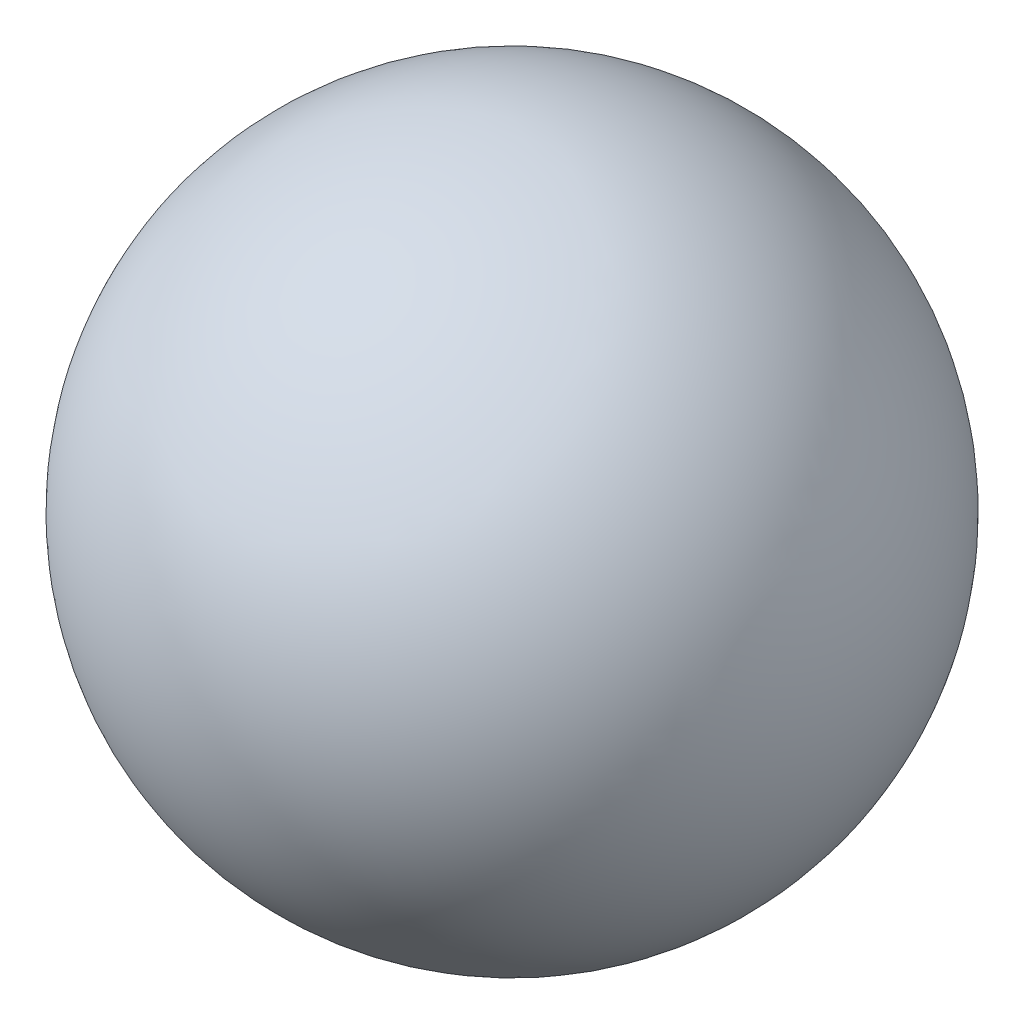
ISO-10303-21;
HEADER;
FILE_DESCRIPTION(('STEP AP214'),'2;1');
FILE_NAME('part.step','',(''),(''),'','','');
FILE_SCHEMA(('AUTOMOTIVE_DESIGN { 1 0 10303 214 1 1 1 1 }'));
ENDSEC;
DATA;
#1=APPLICATION_CONTEXT('core data for automotive mechanical design processes');
#2=APPLICATION_PROTOCOL_DEFINITION('international standard','automotive_design',2000,#1);
#3=PRODUCT_CONTEXT('',#1,'mechanical');
#4=PRODUCT('Part','Part','',(#3));
#5=PRODUCT_RELATED_PRODUCT_CATEGORY('part','',(#4));
#6=PRODUCT_DEFINITION_FORMATION('','',#4);
#7=PRODUCT_DEFINITION_CONTEXT('part definition',#1,'design');
#8=PRODUCT_DEFINITION('design','',#6,#7);
#9=PRODUCT_DEFINITION_SHAPE('','',#8);
#10=(LENGTH_UNIT() NAMED_UNIT(*) SI_UNIT(.MILLI.,.METRE.));
#11=(NAMED_UNIT(*) PLANE_ANGLE_UNIT() SI_UNIT($,.RADIAN.));
#12=(NAMED_UNIT(*) SI_UNIT($,.STERADIAN.) SOLID_ANGLE_UNIT());
#13=UNCERTAINTY_MEASURE_WITH_UNIT(LENGTH_MEASURE(1.E-05),#10,'distance_accuracy_value','');
#14=(GEOMETRIC_REPRESENTATION_CONTEXT(3) GLOBAL_UNCERTAINTY_ASSIGNED_CONTEXT((#13)) GLOBAL_UNIT_ASSIGNED_CONTEXT((#10,
#11,#12)) REPRESENTATION_CONTEXT('',''));
#15=CARTESIAN_POINT('',(0.,0.,0.));
#16=DIRECTION('',(0.,0.,1.));
#17=DIRECTION('',(1.,0.,0.));
#18=AXIS2_PLACEMENT_3D('',#15,#16,#17);
#19=CARTESIAN_POINT('',(0.,12.5,0.));
#20=DIRECTION('',(1.,0.,0.));
#21=DIRECTION('',(0.,-1.,0.));
#22=AXIS2_PLACEMENT_3D('',#19,#20,#21);
#23=SPHERICAL_SURFACE('',#22,2.85714285714286);
#24=CARTESIAN_POINT('',(2.85714285714286,12.5,0.));
#25=VERTEX_POINT('',#24);
#26=VERTEX_LOOP('',#25);
#27=FACE_BOUND('',#26,.T.);
#28=ADVANCED_FACE('F346',(#27),#23,.T.);
#29=CLOSED_SHELL('',(#28));
#30=MANIFOLD_SOLID_BREP('B2',#29);
#31=ADVANCED_BREP_SHAPE_REPRESENTATION('',(#18,#30),#14);
#32=SHAPE_DEFINITION_REPRESENTATION(#9,#31);
ENDSEC;
END-ISO-10303-21;
